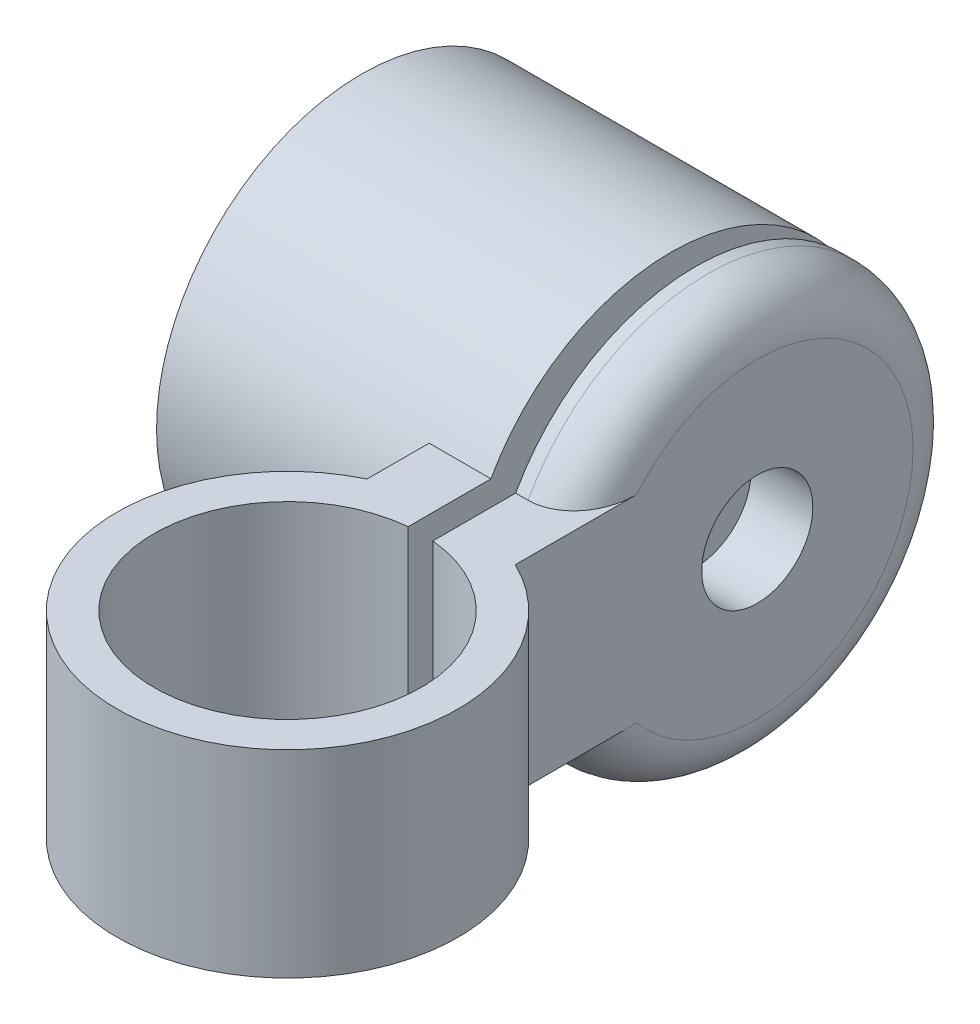
ISO-10303-21;
HEADER;
FILE_DESCRIPTION(('STEP AP214'),'2;1');
FILE_NAME('part.step','',(''),(''),'','','');
FILE_SCHEMA(('AUTOMOTIVE_DESIGN { 1 0 10303 214 1 1 1 1 }'));
ENDSEC;
DATA;
#1=APPLICATION_CONTEXT('core data for automotive mechanical design processes');
#2=APPLICATION_PROTOCOL_DEFINITION('international standard','automotive_design',2000,#1);
#3=PRODUCT_CONTEXT('',#1,'mechanical');
#4=PRODUCT('Part','Part','',(#3));
#5=PRODUCT_RELATED_PRODUCT_CATEGORY('part','',(#4));
#6=PRODUCT_DEFINITION_FORMATION('','',#4);
#7=PRODUCT_DEFINITION_CONTEXT('part definition',#1,'design');
#8=PRODUCT_DEFINITION('design','',#6,#7);
#9=PRODUCT_DEFINITION_SHAPE('','',#8);
#10=(LENGTH_UNIT() NAMED_UNIT(*) SI_UNIT(.MILLI.,.METRE.));
#11=(NAMED_UNIT(*) PLANE_ANGLE_UNIT() SI_UNIT($,.RADIAN.));
#12=(NAMED_UNIT(*) SI_UNIT($,.STERADIAN.) SOLID_ANGLE_UNIT());
#13=UNCERTAINTY_MEASURE_WITH_UNIT(LENGTH_MEASURE(1.E-05),#10,'distance_accuracy_value','');
#14=(GEOMETRIC_REPRESENTATION_CONTEXT(3) GLOBAL_UNCERTAINTY_ASSIGNED_CONTEXT((#13)) GLOBAL_UNIT_ASSIGNED_CONTEXT((#10,
#11,#12)) REPRESENTATION_CONTEXT('',''));
#15=CARTESIAN_POINT('',(0.,0.,0.));
#16=DIRECTION('',(0.,0.,1.));
#17=DIRECTION('',(1.,0.,0.));
#18=AXIS2_PLACEMENT_3D('',#15,#16,#17);
#19=CARTESIAN_POINT('',(-3.,8.,0.));
#20=DIRECTION('',(-1.,0.,0.));
#21=DIRECTION('',(0.,0.,1.));
#22=AXIS2_PLACEMENT_3D('',#19,#20,#21);
#23=PLANE('',#22);
#24=CARTESIAN_POINT('',(-3.,4.,-16.));
#25=DIRECTION('',(-1.,0.,0.));
#26=DIRECTION('',(0.,0.,1.));
#27=AXIS2_PLACEMENT_3D('',#24,#25,#26);
#28=CIRCLE('',#27,5.3);
#29=CARTESIAN_POINT('',(-3.,4.,-10.7));
#30=VERTEX_POINT('',#29);
#31=EDGE_CURVE('E48',#30,#30,#28,.T.);
#32=ORIENTED_EDGE('',*,*,#31,.T.);
#33=EDGE_LOOP('',(#32));
#34=FACE_BOUND('',#33,.T.);
#35=CARTESIAN_POINT('',(-3.,4.,-16.));
#36=DIRECTION('',(-1.,0.,0.));
#37=DIRECTION('',(0.,0.,1.));
#38=AXIS2_PLACEMENT_3D('',#35,#36,#37);
#39=CIRCLE('',#38,2.2479);
#40=CARTESIAN_POINT('',(-3.,4.,-13.7521));
#41=VERTEX_POINT('',#40);
#42=EDGE_CURVE('E140',#41,#41,#39,.T.);
#43=ORIENTED_EDGE('',*,*,#42,.F.);
#44=EDGE_LOOP('',(#43));
#45=FACE_BOUND('',#44,.T.);
#46=ADVANCED_FACE('F39',(#34,#45),#23,.T.);
#47=CARTESIAN_POINT('',(0.,8.,0.));
#48=DIRECTION('',(0.,-1.,0.));
#49=DIRECTION('',(0.,0.,-1.));
#50=AXIS2_PLACEMENT_3D('',#47,#48,#49);
#51=CYLINDRICAL_SURFACE('',#50,5.4);
#52=CARTESIAN_POINT('',(0.,0.,0.));
#53=DIRECTION('',(0.,1.,0.));
#54=DIRECTION('',(0.,0.,1.));
#55=AXIS2_PLACEMENT_3D('',#52,#53,#54);
#56=CIRCLE('',#55,5.4);
#57=CARTESIAN_POINT('',(-0.5,0.,-5.37680202350803));
#58=VERTEX_POINT('',#57);
#59=CARTESIAN_POINT('',(0.5,0.,-5.37680202350803));
#60=VERTEX_POINT('',#59);
#61=EDGE_CURVE('E136',#58,#60,#56,.T.);
#62=ORIENTED_EDGE('',*,*,#61,.F.);
#63=DIRECTION('',(0.,-1.,0.));
#64=VECTOR('',#63,1.);
#65=CARTESIAN_POINT('',(-0.5,8.,-5.37680202350803));
#66=LINE('',#65,#64);
#67=CARTESIAN_POINT('',(-0.5,8.,-5.37680202350803));
#68=VERTEX_POINT('',#67);
#69=EDGE_CURVE('E157',#68,#58,#66,.T.);
#70=ORIENTED_EDGE('',*,*,#69,.F.);
#71=CARTESIAN_POINT('',(0.,8.,0.));
#72=DIRECTION('',(0.,1.,0.));
#73=DIRECTION('',(0.,0.,1.));
#74=AXIS2_PLACEMENT_3D('',#71,#72,#73);
#75=CIRCLE('',#74,5.4);
#76=CARTESIAN_POINT('',(0.5,8.,-5.37680202350803));
#77=VERTEX_POINT('',#76);
#78=EDGE_CURVE('E151',#68,#77,#75,.T.);
#79=ORIENTED_EDGE('',*,*,#78,.T.);
#80=DIRECTION('',(0.,-1.,0.));
#81=VECTOR('',#80,1.);
#82=CARTESIAN_POINT('',(0.5,8.,-5.37680202350803));
#83=LINE('',#82,#81);
#84=EDGE_CURVE('E126',#77,#60,#83,.T.);
#85=ORIENTED_EDGE('',*,*,#84,.T.);
#86=EDGE_LOOP('',(#62,#70,#79,#85));
#87=FACE_BOUND('',#86,.T.);
#88=ADVANCED_FACE('F209',(#87),#51,.F.);
#89=CARTESIAN_POINT('',(-0.5,8.,0.));
#90=DIRECTION('',(-1.,0.,0.));
#91=DIRECTION('',(0.,0.,1.));
#92=AXIS2_PLACEMENT_3D('',#89,#90,#91);
#93=PLANE('',#92);
#94=CARTESIAN_POINT('',(-0.5,4.,-16.));
#95=DIRECTION('',(1.,0.,0.));
#96=DIRECTION('',(0.,0.,-1.));
#97=AXIS2_PLACEMENT_3D('',#94,#95,#96);
#98=CIRCLE('',#97,8.3);
#99=CARTESIAN_POINT('',(-0.5,0.,-8.72744886576932));
#100=VERTEX_POINT('',#99);
#101=CARTESIAN_POINT('',(-0.5,8.,-8.72744886576932));
#102=VERTEX_POINT('',#101);
#103=EDGE_CURVE('E225',#100,#102,#98,.T.);
#104=ORIENTED_EDGE('',*,*,#103,.T.);
#105=DIRECTION('',(0.,0.,-1.));
#106=VECTOR('',#105,1.);
#107=CARTESIAN_POINT('',(-0.5,8.,0.));
#108=LINE('',#107,#106);
#109=EDGE_CURVE('E227',#68,#102,#108,.T.);
#110=ORIENTED_EDGE('',*,*,#109,.F.);
#111=ORIENTED_EDGE('',*,*,#69,.T.);
#112=DIRECTION('',(0.,0.,-1.));
#113=VECTOR('',#112,1.);
#114=CARTESIAN_POINT('',(-0.5,0.,0.));
#115=LINE('',#114,#113);
#116=EDGE_CURVE('E139',#58,#100,#115,.T.);
#117=ORIENTED_EDGE('',*,*,#116,.T.);
#118=EDGE_LOOP('',(#104,#110,#111,#117));
#119=FACE_BOUND('',#118,.T.);
#120=CARTESIAN_POINT('',(-0.5,4.,-16.));
#121=DIRECTION('',(-1.,0.,0.));
#122=DIRECTION('',(0.,0.,1.));
#123=AXIS2_PLACEMENT_3D('',#120,#121,#122);
#124=CIRCLE('',#123,2.2479);
#125=CARTESIAN_POINT('',(-0.5,4.,-13.7521));
#126=VERTEX_POINT('',#125);
#127=EDGE_CURVE('E163',#126,#126,#124,.T.);
#128=ORIENTED_EDGE('',*,*,#127,.T.);
#129=EDGE_LOOP('',(#128));
#130=FACE_BOUND('',#129,.T.);
#131=ADVANCED_FACE('F206',(#119,#130),#93,.F.);
#132=DIRECTION('',(0.,0.,-1.));
#133=VECTOR('',#132,1.);
#134=CARTESIAN_POINT('',(-3.,8.,0.));
#135=LINE('',#134,#133);
#136=CARTESIAN_POINT('',(-3.,8.,-6.21369455316239));
#137=VERTEX_POINT('',#136);
#138=CARTESIAN_POINT('',(-3.,8.,-8.72744886576932));
#139=VERTEX_POINT('',#138);
#140=EDGE_CURVE('E228',#137,#139,#135,.T.);
#141=ORIENTED_EDGE('',*,*,#140,.T.);
#142=CARTESIAN_POINT('',(-3.,4.,-16.));
#143=DIRECTION('',(-1.,0.,0.));
#144=DIRECTION('',(0.,0.,1.));
#145=AXIS2_PLACEMENT_3D('',#142,#143,#144);
#146=CIRCLE('',#145,8.3);
#147=CARTESIAN_POINT('',(-3.,0.,-8.72744886576932));
#148=VERTEX_POINT('',#147);
#149=EDGE_CURVE('E266',#148,#139,#146,.T.);
#150=ORIENTED_EDGE('',*,*,#149,.F.);
#151=DIRECTION('',(0.,0.,-1.));
#152=VECTOR('',#151,1.);
#153=CARTESIAN_POINT('',(-3.,0.,0.));
#154=LINE('',#153,#152);
#155=CARTESIAN_POINT('',(-3.,0.,-6.21369455316239));
#156=VERTEX_POINT('',#155);
#157=EDGE_CURVE('E143',#156,#148,#154,.T.);
#158=ORIENTED_EDGE('',*,*,#157,.F.);
#159=DIRECTION('',(0.,-1.,0.));
#160=VECTOR('',#159,1.);
#161=CARTESIAN_POINT('',(-3.,8.,-6.21369455316239));
#162=LINE('',#161,#160);
#163=EDGE_CURVE('E155',#137,#156,#162,.T.);
#164=ORIENTED_EDGE('',*,*,#163,.F.);
#165=EDGE_LOOP('',(#141,#150,#158,#164));
#166=FACE_BOUND('',#165,.T.);
#167=ADVANCED_FACE('F202',(#166),#23,.T.);
#168=CARTESIAN_POINT('',(0.,8.,0.));
#169=DIRECTION('',(0.,-1.,0.));
#170=DIRECTION('',(0.,0.,-1.));
#171=AXIS2_PLACEMENT_3D('',#168,#169,#170);
#172=CYLINDRICAL_SURFACE('',#171,6.9);
#173=CARTESIAN_POINT('',(0.,0.,0.));
#174=DIRECTION('',(0.,1.,0.));
#175=DIRECTION('',(0.,0.,1.));
#176=AXIS2_PLACEMENT_3D('',#173,#174,#175);
#177=CIRCLE('',#176,6.9);
#178=CARTESIAN_POINT('',(3.,0.,-6.21369455316239));
#179=VERTEX_POINT('',#178);
#180=EDGE_CURVE('E146',#156,#179,#177,.T.);
#181=ORIENTED_EDGE('',*,*,#180,.T.);
#182=DIRECTION('',(0.,-1.,0.));
#183=VECTOR('',#182,1.);
#184=CARTESIAN_POINT('',(3.,8.,-6.21369455316239));
#185=LINE('',#184,#183);
#186=CARTESIAN_POINT('',(3.,8.,-6.21369455316239));
#187=VERTEX_POINT('',#186);
#188=EDGE_CURVE('E130',#187,#179,#185,.T.);
#189=ORIENTED_EDGE('',*,*,#188,.F.);
#190=CARTESIAN_POINT('',(0.,8.,0.));
#191=DIRECTION('',(0.,1.,0.));
#192=DIRECTION('',(0.,0.,1.));
#193=AXIS2_PLACEMENT_3D('',#190,#191,#192);
#194=CIRCLE('',#193,6.9);
#195=EDGE_CURVE('E132',#137,#187,#194,.T.);
#196=ORIENTED_EDGE('',*,*,#195,.F.);
#197=ORIENTED_EDGE('',*,*,#163,.T.);
#198=EDGE_LOOP('',(#181,#189,#196,#197));
#199=FACE_BOUND('',#198,.T.);
#200=ADVANCED_FACE('F198',(#199),#172,.T.);
#201=CARTESIAN_POINT('',(3.,8.,0.));
#202=DIRECTION('',(-1.,0.,0.));
#203=DIRECTION('',(0.,0.,1.));
#204=AXIS2_PLACEMENT_3D('',#201,#202,#203);
#205=PLANE('',#204);
#206=CARTESIAN_POINT('',(3.,4.,-16.));
#207=DIRECTION('',(1.,0.,0.));
#208=DIRECTION('',(0.,0.,-1.));
#209=AXIS2_PLACEMENT_3D('',#206,#207,#208);
#210=CIRCLE('',#209,2.2479);
#211=CARTESIAN_POINT('',(3.,4.,-18.2479));
#212=VERTEX_POINT('',#211);
#213=EDGE_CURVE('E164',#212,#212,#210,.T.);
#214=ORIENTED_EDGE('',*,*,#213,.F.);
#215=EDGE_LOOP('',(#214));
#216=FACE_BOUND('',#215,.T.);
#217=CARTESIAN_POINT('',(3.,4.,-16.));
#218=DIRECTION('',(-1.,0.,0.));
#219=DIRECTION('',(0.,0.,1.));
#220=AXIS2_PLACEMENT_3D('',#217,#218,#219);
#221=CIRCLE('',#220,6.3);
#222=CARTESIAN_POINT('',(3.,0.,-11.1327625905448));
#223=VERTEX_POINT('',#222);
#224=CARTESIAN_POINT('',(3.,8.,-11.1327625905448));
#225=VERTEX_POINT('',#224);
#226=EDGE_CURVE('E159',#223,#225,#221,.F.);
#227=ORIENTED_EDGE('',*,*,#226,.T.);
#228=DIRECTION('',(0.,0.,-1.));
#229=VECTOR('',#228,1.);
#230=CARTESIAN_POINT('',(3.,8.,0.));
#231=LINE('',#230,#229);
#232=EDGE_CURVE('E128',#187,#225,#231,.T.);
#233=ORIENTED_EDGE('',*,*,#232,.F.);
#234=ORIENTED_EDGE('',*,*,#188,.T.);
#235=DIRECTION('',(0.,0.,-1.));
#236=VECTOR('',#235,1.);
#237=CARTESIAN_POINT('',(3.,0.,0.));
#238=LINE('',#237,#236);
#239=EDGE_CURVE('E148',#179,#223,#238,.T.);
#240=ORIENTED_EDGE('',*,*,#239,.T.);
#241=EDGE_LOOP('',(#227,#233,#234,#240));
#242=FACE_BOUND('',#241,.T.);
#243=ADVANCED_FACE('F195',(#216,#242),#205,.F.);
#244=CARTESIAN_POINT('',(0.5,8.,0.));
#245=DIRECTION('',(-1.,0.,0.));
#246=DIRECTION('',(0.,0.,1.));
#247=AXIS2_PLACEMENT_3D('',#244,#245,#246);
#248=PLANE('',#247);
#249=DIRECTION('',(0.,0.,-1.));
#250=VECTOR('',#249,1.);
#251=CARTESIAN_POINT('',(0.5,8.,0.));
#252=LINE('',#251,#250);
#253=CARTESIAN_POINT('',(0.5,8.,-8.72744886576932));
#254=VERTEX_POINT('',#253);
#255=EDGE_CURVE('E114',#77,#254,#252,.T.);
#256=ORIENTED_EDGE('',*,*,#255,.T.);
#257=CARTESIAN_POINT('',(0.5,4.,-16.));
#258=DIRECTION('',(-1.,0.,0.));
#259=DIRECTION('',(0.,0.,1.));
#260=AXIS2_PLACEMENT_3D('',#257,#258,#259);
#261=CIRCLE('',#260,8.3);
#262=CARTESIAN_POINT('',(0.5,0.,-8.72744886576932));
#263=VERTEX_POINT('',#262);
#264=EDGE_CURVE('E116',#254,#263,#261,.T.);
#265=ORIENTED_EDGE('',*,*,#264,.T.);
#266=DIRECTION('',(0.,0.,-1.));
#267=VECTOR('',#266,1.);
#268=CARTESIAN_POINT('',(0.5,0.,0.));
#269=LINE('',#268,#267);
#270=EDGE_CURVE('E150',#60,#263,#269,.T.);
#271=ORIENTED_EDGE('',*,*,#270,.F.);
#272=ORIENTED_EDGE('',*,*,#84,.F.);
#273=EDGE_LOOP('',(#256,#265,#271,#272));
#274=FACE_BOUND('',#273,.T.);
#275=CARTESIAN_POINT('',(0.5,4.,-16.));
#276=DIRECTION('',(-1.,0.,0.));
#277=DIRECTION('',(0.,0.,1.));
#278=AXIS2_PLACEMENT_3D('',#275,#276,#277);
#279=CIRCLE('',#278,2.2479);
#280=CARTESIAN_POINT('',(0.5,4.,-13.7521));
#281=VERTEX_POINT('',#280);
#282=EDGE_CURVE('E160',#281,#281,#279,.T.);
#283=ORIENTED_EDGE('',*,*,#282,.F.);
#284=EDGE_LOOP('',(#283));
#285=FACE_BOUND('',#284,.T.);
#286=ADVANCED_FACE('F124',(#274,#285),#248,.T.);
#287=CARTESIAN_POINT('',(0.,8.,0.));
#288=DIRECTION('',(0.,1.,0.));
#289=DIRECTION('',(0.,0.,1.));
#290=AXIS2_PLACEMENT_3D('',#287,#288,#289);
#291=PLANE('',#290);
#292=ORIENTED_EDGE('',*,*,#232,.T.);
#293=CARTESIAN_POINT('',(3.,8.,-11.1327625905448));
#294=CARTESIAN_POINT('',(2.9999891089723,8.,-11.0481692393498));
#295=CARTESIAN_POINT('',(2.996791838549,8.,-10.9636039512573));
#296=CARTESIAN_POINT('',(2.9835856028718,8.,-10.7948738422448));
#297=CARTESIAN_POINT('',(2.97356548761491,8.,-10.7107099042847));
#298=CARTESIAN_POINT('',(2.93250071687513,8.,-10.4589939082327));
#299=CARTESIAN_POINT('',(2.89044350277209,8.,-10.2929982577921));
#300=CARTESIAN_POINT('',(2.78862312092246,8.,-10.0110123531661));
#301=CARTESIAN_POINT('',(2.73553870622106,8.,-9.89258750484325));
#302=CARTESIAN_POINT('',(2.61078634488245,8.,-9.66616378118585));
#303=CARTESIAN_POINT('',(2.53916328801898,8.,-9.55814057426116));
#304=CARTESIAN_POINT('',(2.37708574466684,8.,-9.35569140374907));
#305=CARTESIAN_POINT('',(2.28648299677462,8.,-9.26138303532207));
#306=CARTESIAN_POINT('',(2.08853193537459,8.,-9.09208980530809));
#307=CARTESIAN_POINT('',(1.98118290532938,8.,-9.01710577093206));
#308=CARTESIAN_POINT('',(1.76813215317367,8.,-8.89919087329574));
#309=CARTESIAN_POINT('',(1.66402908746245,8.,-8.85336099396714));
#310=CARTESIAN_POINT('',(1.44916353789657,8.,-8.78214553409971));
#311=CARTESIAN_POINT('',(1.33841763827181,8.,-8.75671114559462));
#312=CARTESIAN_POINT('',(1.18887435407054,8.,-8.73723742514341));
#313=CARTESIAN_POINT('',(1.15116390764455,8.,-8.73356675679931));
#314=CARTESIAN_POINT('',(1.07564235175161,8.,-8.72867587923526));
#315=CARTESIAN_POINT('',(1.03783148472639,8.,-8.72745192770227));
#316=CARTESIAN_POINT('',(1.00000000000005,8.,-8.72744886576892));
#317=B_SPLINE_CURVE_WITH_KNOTS('',3,(#293,#294,#295,#296,#297,#298,#299,#300,#301,#302,#303,
#304,#305,#306,#307,#308,#309,#310,#311,#312,#313,#314,#315,#316),.UNSPECIFIED.,.F.,.F.,(4,2,2,
2,2,2,2,2,2,2,2,4),(0.,0.253644267219881,0.507704041985964,1.0181374993493,1.40597496192942,
1.79288195366135,2.18293222041718,2.57299918116501,2.91237811823462,3.25094245139176,
3.36454996097728,3.47798357174368),.UNSPECIFIED.);
#318=CARTESIAN_POINT('',(1.,8.,-8.72744886576932));
#319=VERTEX_POINT('',#318);
#320=EDGE_CURVE('E55',#225,#319,#317,.T.);
#321=ORIENTED_EDGE('',*,*,#320,.T.);
#322=DIRECTION('',(-1.,0.,0.));
#323=VECTOR('',#322,1.);
#324=CARTESIAN_POINT('',(25.7610269721783,8.,-8.72744886576932));
#325=LINE('',#324,#323);
#326=EDGE_CURVE('E109',#319,#254,#325,.T.);
#327=ORIENTED_EDGE('',*,*,#326,.T.);
#328=ORIENTED_EDGE('',*,*,#255,.F.);
#329=ORIENTED_EDGE('',*,*,#78,.F.);
#330=ORIENTED_EDGE('',*,*,#109,.T.);
#331=DIRECTION('',(1.,0.,0.));
#332=VECTOR('',#331,1.);
#333=CARTESIAN_POINT('',(-25.7610269721783,8.,-8.72744886576932));
#334=LINE('',#333,#332);
#335=EDGE_CURVE('E271',#139,#102,#334,.T.);
#336=ORIENTED_EDGE('',*,*,#335,.F.);
#337=ORIENTED_EDGE('',*,*,#140,.F.);
#338=ORIENTED_EDGE('',*,*,#195,.T.);
#339=EDGE_LOOP('',(#292,#321,#327,#328,#329,#330,#336,#337,#338));
#340=FACE_BOUND('',#339,.T.);
#341=ADVANCED_FACE('F111',(#340),#291,.T.);
#342=CARTESIAN_POINT('',(0.,0.,0.));
#343=DIRECTION('',(0.,1.,0.));
#344=DIRECTION('',(0.,0.,1.));
#345=AXIS2_PLACEMENT_3D('',#342,#343,#344);
#346=PLANE('',#345);
#347=ORIENTED_EDGE('',*,*,#270,.T.);
#348=DIRECTION('',(-1.,0.,0.));
#349=VECTOR('',#348,1.);
#350=CARTESIAN_POINT('',(25.7610269721783,0.,-8.72744886576932));
#351=LINE('',#350,#349);
#352=CARTESIAN_POINT('',(1.,0.,-8.72744886576932));
#353=VERTEX_POINT('',#352);
#354=EDGE_CURVE('E115',#353,#263,#351,.T.);
#355=ORIENTED_EDGE('',*,*,#354,.F.);
#356=CARTESIAN_POINT('',(1.,0.,-8.72744886576932));
#357=CARTESIAN_POINT('',(1.05087587307284,0.,-8.72744042236826));
#358=CARTESIAN_POINT('',(1.10174764382998,0.,-8.72966419988264));
#359=CARTESIAN_POINT('',(1.20309500896542,0.,-8.73851147525015));
#360=CARTESIAN_POINT('',(1.25357069752935,0.,-8.74513389295179));
#361=CARTESIAN_POINT('',(1.35359276177324,0.,-8.76268386778873));
#362=CARTESIAN_POINT('',(1.40314171576346,0.,-8.77359669496528));
#363=CARTESIAN_POINT('',(1.50111950692415,0.,-8.79959436484923));
#364=CARTESIAN_POINT('',(1.54954831645586,0.,-8.81467931038187));
#365=CARTESIAN_POINT('',(1.69260289085783,0.,-8.86595243375433));
#366=CARTESIAN_POINT('',(1.7851358821413,0.,-8.90818374077941));
#367=CARTESIAN_POINT('',(1.9621300303491,0.,-9.00701001111989));
#368=CARTESIAN_POINT('',(2.04658697151871,0.,-9.06361242051118));
#369=CARTESIAN_POINT('',(2.20885799526656,0.,-9.19154551175457));
#370=CARTESIAN_POINT('',(2.28628900568346,0.,-9.26336101469872));
#371=CARTESIAN_POINT('',(2.42945430447208,0.,-9.41778549880615));
#372=CARTESIAN_POINT('',(2.49518514896578,0.,-9.50039764553284));
#373=CARTESIAN_POINT('',(2.62109629193875,0.,-9.68380364132751));
#374=CARTESIAN_POINT('',(2.6798162865718,0.,-9.78559728976832));
#375=CARTESIAN_POINT('',(2.78200026173224,0.,-9.99657013224946));
#376=CARTESIAN_POINT('',(2.82545288892786,0.,-10.1057547508112));
#377=CARTESIAN_POINT('',(2.90330769244652,0.,-10.3467206301423));
#378=CARTESIAN_POINT('',(2.93515141369572,0.,-10.4793233044447));
#379=CARTESIAN_POINT('',(2.98016821622198,0.,-10.7474900380129));
#380=CARTESIAN_POINT('',(2.99335480444212,0.,-10.8830518826975));
#381=CARTESIAN_POINT('',(2.99935471538324,0.,-11.0567817035443));
#382=CARTESIAN_POINT('',(3.00000112148011,0.,-11.0947796309189));
#383=CARTESIAN_POINT('',(3.,0.,-11.1327625905448));
#384=B_SPLINE_CURVE_WITH_KNOTS('',3,(#356,#357,#358,#359,#360,#361,#362,#363,#364,#365,#366,
#367,#368,#369,#370,#371,#372,#373,#374,#375,#376,#377,#378,#379,#380,#381,#382,#383),
.UNSPECIFIED.,.F.,.F.,(4,2,2,2,2,2,2,2,2,2,2,2,2,4),(0.,0.152572081816683,0.305106711135532,
0.457122164164249,0.609141364071693,0.912761318856167,1.21653890993622,1.53206124084644,
1.84767629095616,2.1988594648021,2.55030324037116,2.95794732893996,3.3652961498616,
3.47927732225061),.UNSPECIFIED.);
#385=EDGE_CURVE('E174',#353,#223,#384,.T.);
#386=ORIENTED_EDGE('',*,*,#385,.T.);
#387=ORIENTED_EDGE('',*,*,#239,.F.);
#388=ORIENTED_EDGE('',*,*,#180,.F.);
#389=ORIENTED_EDGE('',*,*,#157,.T.);
#390=DIRECTION('',(1.,0.,0.));
#391=VECTOR('',#390,1.);
#392=CARTESIAN_POINT('',(-25.7610269721783,0.,-8.72744886576932));
#393=LINE('',#392,#391);
#394=EDGE_CURVE('E222',#148,#100,#393,.T.);
#395=ORIENTED_EDGE('',*,*,#394,.T.);
#396=ORIENTED_EDGE('',*,*,#116,.F.);
#397=ORIENTED_EDGE('',*,*,#61,.T.);
#398=EDGE_LOOP('',(#347,#355,#386,#387,#388,#389,#395,#396,#397));
#399=FACE_BOUND('',#398,.T.);
#400=ADVANCED_FACE('F186',(#399),#346,.F.);
#401=CARTESIAN_POINT('',(3.,4.,-16.));
#402=DIRECTION('',(1.,0.,0.));
#403=DIRECTION('',(0.,0.,-1.));
#404=AXIS2_PLACEMENT_3D('',#401,#402,#403);
#405=CYLINDRICAL_SURFACE('',#404,2.2479);
#406=ORIENTED_EDGE('',*,*,#282,.T.);
#407=EDGE_LOOP('',(#406));
#408=FACE_BOUND('',#407,.T.);
#409=ORIENTED_EDGE('',*,*,#213,.T.);
#410=EDGE_LOOP('',(#409));
#411=FACE_BOUND('',#410,.T.);
#412=ADVANCED_FACE('F187',(#408,#411),#405,.F.);
#413=ORIENTED_EDGE('',*,*,#42,.T.);
#414=EDGE_LOOP('',(#413));
#415=FACE_BOUND('',#414,.T.);
#416=ORIENTED_EDGE('',*,*,#127,.F.);
#417=EDGE_LOOP('',(#416));
#418=FACE_BOUND('',#417,.T.);
#419=ADVANCED_FACE('F283',(#415,#418),#405,.F.);
#420=CARTESIAN_POINT('',(-13.,4.,-16.));
#421=DIRECTION('',(-1.,0.,0.));
#422=DIRECTION('',(0.,0.,1.));
#423=AXIS2_PLACEMENT_3D('',#420,#421,#422);
#424=PLANE('',#423);
#425=CARTESIAN_POINT('',(-13.,4.,-16.));
#426=DIRECTION('',(-1.,0.,0.));
#427=DIRECTION('',(0.,0.,1.));
#428=AXIS2_PLACEMENT_3D('',#425,#426,#427);
#429=CIRCLE('',#428,8.3);
#430=CARTESIAN_POINT('',(-13.,4.,-7.7));
#431=VERTEX_POINT('',#430);
#432=EDGE_CURVE('E269',#431,#431,#429,.T.);
#433=ORIENTED_EDGE('',*,*,#432,.T.);
#434=EDGE_LOOP('',(#433));
#435=FACE_BOUND('',#434,.T.);
#436=CARTESIAN_POINT('',(-13.,4.,-16.));
#437=DIRECTION('',(-1.,0.,0.));
#438=DIRECTION('',(0.,0.,1.));
#439=AXIS2_PLACEMENT_3D('',#436,#437,#438);
#440=CIRCLE('',#439,6.3);
#441=CARTESIAN_POINT('',(-13.,4.,-9.7));
#442=VERTEX_POINT('',#441);
#443=EDGE_CURVE('E264',#442,#442,#440,.T.);
#444=ORIENTED_EDGE('',*,*,#443,.F.);
#445=EDGE_LOOP('',(#444));
#446=FACE_BOUND('',#445,.T.);
#447=ADVANCED_FACE('F286',(#435,#446),#424,.T.);
#448=CARTESIAN_POINT('',(-13.,4.,-16.));
#449=DIRECTION('',(1.,0.,0.));
#450=DIRECTION('',(0.,0.,-1.));
#451=AXIS2_PLACEMENT_3D('',#448,#449,#450);
#452=CYLINDRICAL_SURFACE('',#451,8.3);
#453=ORIENTED_EDGE('',*,*,#432,.F.);
#454=EDGE_LOOP('',(#453));
#455=FACE_BOUND('',#454,.T.);
#456=ORIENTED_EDGE('',*,*,#149,.T.);
#457=ORIENTED_EDGE('',*,*,#335,.T.);
#458=ORIENTED_EDGE('',*,*,#103,.F.);
#459=ORIENTED_EDGE('',*,*,#394,.F.);
#460=EDGE_LOOP('',(#456,#457,#458,#459));
#461=FACE_BOUND('',#460,.T.);
#462=ADVANCED_FACE('F260',(#455,#461),#452,.T.);
#463=CARTESIAN_POINT('',(-13.,4.,-16.));
#464=DIRECTION('',(1.,0.,0.));
#465=DIRECTION('',(0.,0.,-1.));
#466=AXIS2_PLACEMENT_3D('',#463,#464,#465);
#467=CYLINDRICAL_SURFACE('',#466,6.3);
#468=CARTESIAN_POINT('',(-4.7320508075689,4.,-16.));
#469=DIRECTION('',(-1.,0.,0.));
#470=DIRECTION('',(0.,0.,1.));
#471=AXIS2_PLACEMENT_3D('',#468,#469,#470);
#472=CIRCLE('',#471,6.3);
#473=CARTESIAN_POINT('',(-4.7320508075689,4.,-9.7));
#474=VERTEX_POINT('',#473);
#475=EDGE_CURVE('E11',#474,#474,#472,.F.);
#476=ORIENTED_EDGE('',*,*,#475,.T.);
#477=EDGE_LOOP('',(#476));
#478=FACE_BOUND('',#477,.T.);
#479=ORIENTED_EDGE('',*,*,#443,.T.);
#480=EDGE_LOOP('',(#479));
#481=FACE_BOUND('',#480,.T.);
#482=ADVANCED_FACE('F257',(#478,#481),#467,.F.);
#483=CARTESIAN_POINT('',(25.7610269721783,4.,-16.));
#484=DIRECTION('',(-1.,0.,0.));
#485=DIRECTION('',(0.,0.,1.));
#486=AXIS2_PLACEMENT_3D('',#483,#484,#485);
#487=CYLINDRICAL_SURFACE('',#486,8.3);
#488=ORIENTED_EDGE('',*,*,#326,.F.);
#489=CARTESIAN_POINT('',(1.,4.,-16.));
#490=DIRECTION('',(-1.,0.,0.));
#491=DIRECTION('',(0.,0.,1.));
#492=AXIS2_PLACEMENT_3D('',#489,#490,#491);
#493=CIRCLE('',#492,8.3);
#494=EDGE_CURVE('E62',#319,#353,#493,.T.);
#495=ORIENTED_EDGE('',*,*,#494,.T.);
#496=ORIENTED_EDGE('',*,*,#354,.T.);
#497=ORIENTED_EDGE('',*,*,#264,.F.);
#498=EDGE_LOOP('',(#488,#495,#496,#497));
#499=FACE_BOUND('',#498,.T.);
#500=ADVANCED_FACE('F119',(#499),#487,.T.);
#501=CARTESIAN_POINT('',(1.,4.,-16.));
#502=DIRECTION('',(-1.,0.,0.));
#503=DIRECTION('',(0.,0.,1.));
#504=AXIS2_PLACEMENT_3D('',#501,#502,#503);
#505=TOROIDAL_SURFACE('',#504,6.3,2.);
#506=ORIENTED_EDGE('',*,*,#385,.F.);
#507=ORIENTED_EDGE('',*,*,#494,.F.);
#508=ORIENTED_EDGE('',*,*,#320,.F.);
#509=ORIENTED_EDGE('',*,*,#226,.F.);
#510=EDGE_LOOP('',(#506,#507,#508,#509));
#511=FACE_BOUND('',#510,.T.);
#512=ADVANCED_FACE('F180',(#511),#505,.T.);
#513=CARTESIAN_POINT('',(-3.,4.,-16.));
#514=DIRECTION('',(-1.,0.,0.));
#515=DIRECTION('',(0.,0.,1.));
#516=AXIS2_PLACEMENT_3D('',#513,#514,#515);
#517=CONICAL_SURFACE('',#516,5.3,0.523598775598292);
#518=CARTESIAN_POINT('',(-4.7320508075689,4.,-9.7));
#519=CARTESIAN_POINT('',(-4.71400861165672,4.,-9.71041666666667));
#520=CARTESIAN_POINT('',(-4.69596641574455,4.,-9.72083333333333));
#521=CARTESIAN_POINT('',(-4.6598820239202,4.,-9.74166666666667));
#522=CARTESIAN_POINT('',(-4.64183982800802,4.,-9.75208333333333));
#523=CARTESIAN_POINT('',(-4.60575543618367,4.,-9.77291666666667));
#524=CARTESIAN_POINT('',(-4.58771324027149,4.,-9.78333333333333));
#525=CARTESIAN_POINT('',(-4.55162884844714,4.,-9.80416666666667));
#526=CARTESIAN_POINT('',(-4.53358665253496,4.,-9.81458333333333));
#527=CARTESIAN_POINT('',(-4.49750226071061,4.,-9.83541666666667));
#528=CARTESIAN_POINT('',(-4.47946006479843,4.,-9.84583333333333));
#529=CARTESIAN_POINT('',(-4.44337567297408,4.,-9.86666666666667));
#530=CARTESIAN_POINT('',(-4.42533347706191,4.,-9.87708333333333));
#531=CARTESIAN_POINT('',(-4.38924908523755,4.,-9.89791666666667));
#532=CARTESIAN_POINT('',(-4.37120688932538,4.,-9.90833333333333));
#533=CARTESIAN_POINT('',(-4.33512249750103,4.,-9.92916666666667));
#534=CARTESIAN_POINT('',(-4.31708030158885,4.,-9.93958333333333));
#535=CARTESIAN_POINT('',(-4.2809959097645,4.,-9.96041666666667));
#536=CARTESIAN_POINT('',(-4.26295371385232,4.,-9.97083333333333));
#537=CARTESIAN_POINT('',(-4.22686932202797,4.,-9.99166666666667));
#538=CARTESIAN_POINT('',(-4.20882712611579,4.,-10.0020833333333));
#539=CARTESIAN_POINT('',(-4.17274273429144,4.,-10.0229166666667));
#540=CARTESIAN_POINT('',(-4.15470053837927,4.,-10.0333333333333));
#541=CARTESIAN_POINT('',(-4.11861614655491,4.,-10.0541666666667));
#542=CARTESIAN_POINT('',(-4.10057395064274,4.,-10.0645833333333));
#543=CARTESIAN_POINT('',(-4.06448955881839,4.,-10.0854166666667));
#544=CARTESIAN_POINT('',(-4.04644736290621,4.,-10.0958333333333));
#545=CARTESIAN_POINT('',(-4.01036297108186,4.,-10.1166666666667));
#546=CARTESIAN_POINT('',(-3.99232077516968,4.,-10.1270833333333));
#547=CARTESIAN_POINT('',(-3.95623638334533,4.,-10.1479166666667));
#548=CARTESIAN_POINT('',(-3.93819418743315,4.,-10.1583333333333));
#549=CARTESIAN_POINT('',(-3.9021097956088,4.,-10.1791666666667));
#550=CARTESIAN_POINT('',(-3.88406759969663,4.,-10.1895833333333));
#551=CARTESIAN_POINT('',(-3.84798320787227,4.,-10.2104166666667));
#552=CARTESIAN_POINT('',(-3.8299410119601,4.,-10.2208333333333));
#553=CARTESIAN_POINT('',(-3.79385662013575,4.,-10.2416666666667));
#554=CARTESIAN_POINT('',(-3.77581442422357,4.,-10.2520833333333));
#555=CARTESIAN_POINT('',(-3.73973003239922,4.,-10.2729166666667));
#556=CARTESIAN_POINT('',(-3.72168783648704,4.,-10.2833333333333));
#557=CARTESIAN_POINT('',(-3.68560344466269,4.,-10.3041666666667));
#558=CARTESIAN_POINT('',(-3.66756124875051,4.,-10.3145833333333));
#559=CARTESIAN_POINT('',(-3.63147685692616,4.,-10.3354166666667));
#560=CARTESIAN_POINT('',(-3.61343466101398,4.,-10.3458333333333));
#561=CARTESIAN_POINT('',(-3.57735026918963,4.,-10.3666666666667));
#562=CARTESIAN_POINT('',(-3.55930807327746,4.,-10.3770833333333));
#563=CARTESIAN_POINT('',(-3.5232236814531,4.,-10.3979166666667));
#564=CARTESIAN_POINT('',(-3.50518148554093,4.,-10.4083333333333));
#565=CARTESIAN_POINT('',(-3.46909709371658,4.,-10.4291666666667));
#566=CARTESIAN_POINT('',(-3.4510548978044,4.,-10.4395833333333));
#567=CARTESIAN_POINT('',(-3.41497050598005,4.,-10.4604166666667));
#568=CARTESIAN_POINT('',(-3.39692831006787,4.,-10.4708333333333));
#569=CARTESIAN_POINT('',(-3.36084391824352,4.,-10.4916666666667));
#570=CARTESIAN_POINT('',(-3.34280172233134,4.,-10.5020833333333));
#571=CARTESIAN_POINT('',(-3.30671733050699,4.,-10.5229166666667));
#572=CARTESIAN_POINT('',(-3.28867513459482,4.,-10.5333333333333));
#573=CARTESIAN_POINT('',(-3.25259074277046,4.,-10.5541666666667));
#574=CARTESIAN_POINT('',(-3.23454854685829,4.,-10.5645833333333));
#575=CARTESIAN_POINT('',(-3.19846415503394,4.,-10.5854166666667));
#576=CARTESIAN_POINT('',(-3.18042195912176,4.,-10.5958333333333));
#577=CARTESIAN_POINT('',(-3.14433756729741,4.,-10.6166666666667));
#578=CARTESIAN_POINT('',(-3.12629537138523,4.,-10.6270833333333));
#579=CARTESIAN_POINT('',(-3.09021097956088,4.,-10.6479166666667));
#580=CARTESIAN_POINT('',(-3.0721687836487,4.,-10.6583333333333));
#581=CARTESIAN_POINT('',(-3.03608439182435,4.,-10.6791666666667));
#582=CARTESIAN_POINT('',(-3.01804219591218,4.,-10.6895833333333));
#583=CARTESIAN_POINT('',(-3.,4.,-10.7));
#584=B_SPLINE_CURVE_WITH_KNOTS('',3,(#518,#519,#520,#521,#522,#523,#524,#525,#526,#527,#528,
#529,#530,#531,#532,#533,#534,#535,#536,#537,#538,#539,#540,#541,#542,#543,#544,#545,#546,#547,
#548,#549,#550,#551,#552,#553,#554,#555,#556,#557,#558,#559,#560,#561,#562,#563,#564,#565,#566,
#567,#568,#569,#570,#571,#572,#573,#574,#575,#576,#577,#578,#579,#580,#581,#582,#583),
.UNSPECIFIED.,.F.,.F.,(4,2,2,2,2,2,2,2,2,2,2,2,2,2,2,2,2,2,2,2,2,2,2,2,2,2,2,2,2,2,2,2,4),(0.,
0.0625000000000002,0.125000000000001,0.187500000000001,0.250000000000002,0.312500000000003,
0.375000000000003,0.437500000000003,0.500000000000004,0.562500000000005,0.625000000000005,
0.687500000000006,0.750000000000007,0.812500000000008,0.875000000000008,0.937500000000009,
1.00000000000001,1.06250000000001,1.12500000000001,1.18750000000001,1.25000000000001,
1.31250000000001,1.37500000000001,1.43750000000001,1.50000000000001,1.56250000000002,
1.62500000000002,1.68750000000002,1.75000000000002,1.81250000000002,1.87500000000002,
1.93750000000002,2.00000000000002),.UNSPECIFIED.);
#585=EDGE_CURVE('BSEAM42',#474,#30,#584,.T.);
#586=ORIENTED_EDGE('',*,*,#475,.F.);
#587=ORIENTED_EDGE('',*,*,#31,.F.);
#588=ORIENTED_EDGE('',*,*,#585,.T.);
#589=ORIENTED_EDGE('',*,*,#585,.F.);
#590=EDGE_LOOP('',(#586,#588,#587,#589));
#591=FACE_BOUND('',#590,.T.);
#592=ADVANCED_FACE('F42',(#591),#517,.F.);
#593=CLOSED_SHELL('',(#46,#88,#131,#167,#200,#243,#286,#341,#400,#412,#419,#447,#462,#482,#500,
#512,#592));
#594=MANIFOLD_SOLID_BREP('B2',#593);
#595=ADVANCED_BREP_SHAPE_REPRESENTATION('',(#18,#594),#14);
#596=SHAPE_DEFINITION_REPRESENTATION(#9,#595);
ENDSEC;
END-ISO-10303-21;
